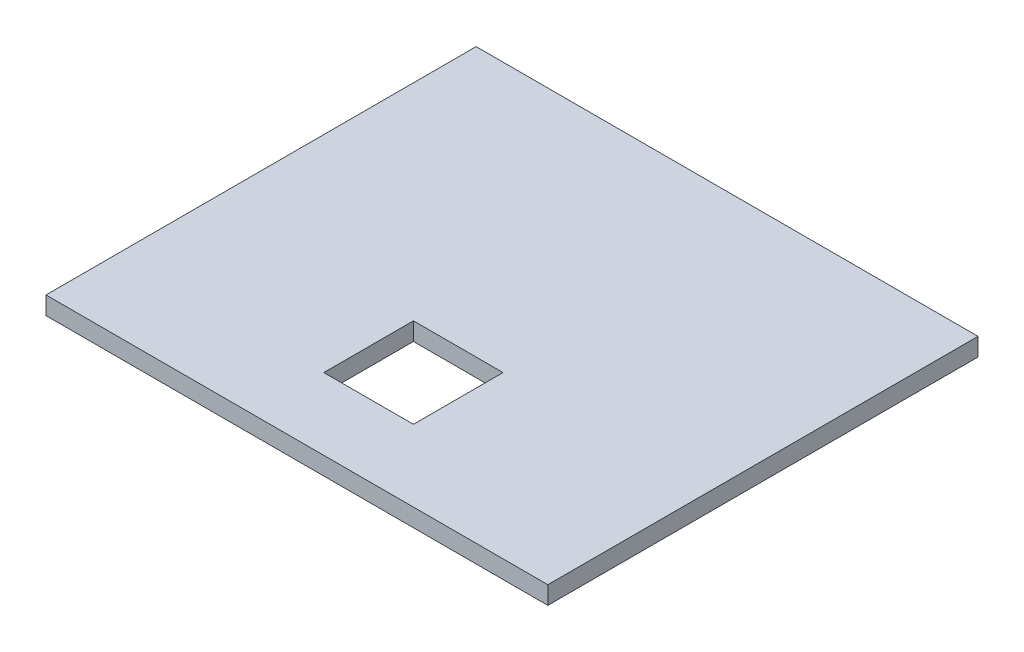
ISO-10303-21;
HEADER;
FILE_DESCRIPTION(('STEP AP214'),'2;1');
FILE_NAME('part.step','',(''),(''),'','','');
FILE_SCHEMA(('AUTOMOTIVE_DESIGN { 1 0 10303 214 1 1 1 1 }'));
ENDSEC;
DATA;
#1=APPLICATION_CONTEXT('core data for automotive mechanical design processes');
#2=APPLICATION_PROTOCOL_DEFINITION('international standard','automotive_design',2000,#1);
#3=PRODUCT_CONTEXT('',#1,'mechanical');
#4=PRODUCT('Part','Part','',(#3));
#5=PRODUCT_RELATED_PRODUCT_CATEGORY('part','',(#4));
#6=PRODUCT_DEFINITION_FORMATION('','',#4);
#7=PRODUCT_DEFINITION_CONTEXT('part definition',#1,'design');
#8=PRODUCT_DEFINITION('design','',#6,#7);
#9=PRODUCT_DEFINITION_SHAPE('','',#8);
#10=(LENGTH_UNIT() NAMED_UNIT(*) SI_UNIT(.MILLI.,.METRE.));
#11=(NAMED_UNIT(*) PLANE_ANGLE_UNIT() SI_UNIT($,.RADIAN.));
#12=(NAMED_UNIT(*) SI_UNIT($,.STERADIAN.) SOLID_ANGLE_UNIT());
#13=UNCERTAINTY_MEASURE_WITH_UNIT(LENGTH_MEASURE(1.E-05),#10,'distance_accuracy_value','');
#14=(GEOMETRIC_REPRESENTATION_CONTEXT(3) GLOBAL_UNCERTAINTY_ASSIGNED_CONTEXT((#13)) GLOBAL_UNIT_ASSIGNED_CONTEXT((#10,
#11,#12)) REPRESENTATION_CONTEXT('',''));
#15=CARTESIAN_POINT('',(0.,0.,0.));
#16=DIRECTION('',(0.,0.,1.));
#17=DIRECTION('',(1.,0.,0.));
#18=AXIS2_PLACEMENT_3D('',#15,#16,#17);
#19=CARTESIAN_POINT('',(88.9,6.35,76.2));
#20=DIRECTION('',(-1.,0.,0.));
#21=DIRECTION('',(0.,0.,1.));
#22=AXIS2_PLACEMENT_3D('',#19,#20,#21);
#23=PLANE('',#22);
#24=DIRECTION('',(0.,0.,-1.));
#25=VECTOR('',#24,1.);
#26=CARTESIAN_POINT('',(88.9,0.,76.2));
#27=LINE('',#26,#25);
#28=CARTESIAN_POINT('',(88.9,0.,76.2));
#29=VERTEX_POINT('',#28);
#30=CARTESIAN_POINT('',(88.9,0.,-76.2));
#31=VERTEX_POINT('',#30);
#32=EDGE_CURVE('E147',#29,#31,#27,.T.);
#33=ORIENTED_EDGE('',*,*,#32,.T.);
#34=DIRECTION('',(0.,-1.,0.));
#35=VECTOR('',#34,1.);
#36=CARTESIAN_POINT('',(88.9,6.35,-76.2));
#37=LINE('',#36,#35);
#38=CARTESIAN_POINT('',(88.9,6.35,-76.2));
#39=VERTEX_POINT('',#38);
#40=EDGE_CURVE('E11',#39,#31,#37,.T.);
#41=ORIENTED_EDGE('',*,*,#40,.F.);
#42=DIRECTION('',(0.,0.,-1.));
#43=VECTOR('',#42,1.);
#44=CARTESIAN_POINT('',(88.9,6.35,76.2));
#45=LINE('',#44,#43);
#46=CARTESIAN_POINT('',(88.9,6.35,76.2));
#47=VERTEX_POINT('',#46);
#48=EDGE_CURVE('E153',#47,#39,#45,.T.);
#49=ORIENTED_EDGE('',*,*,#48,.F.);
#50=DIRECTION('',(0.,-1.,0.));
#51=VECTOR('',#50,1.);
#52=CARTESIAN_POINT('',(88.9,6.35,76.2));
#53=LINE('',#52,#51);
#54=EDGE_CURVE('E167',#47,#29,#53,.T.);
#55=ORIENTED_EDGE('',*,*,#54,.T.);
#56=EDGE_LOOP('',(#33,#41,#49,#55));
#57=FACE_BOUND('',#56,.T.);
#58=ADVANCED_FACE('F39',(#57),#23,.F.);
#59=CARTESIAN_POINT('',(-88.9,6.35,-76.2));
#60=DIRECTION('',(0.,0.,1.));
#61=DIRECTION('',(1.,0.,0.));
#62=AXIS2_PLACEMENT_3D('',#59,#60,#61);
#63=PLANE('',#62);
#64=DIRECTION('',(-1.,0.,0.));
#65=VECTOR('',#64,1.);
#66=CARTESIAN_POINT('',(-88.9,0.,-76.2));
#67=LINE('',#66,#65);
#68=CARTESIAN_POINT('',(-88.9,0.,-76.2));
#69=VERTEX_POINT('',#68);
#70=EDGE_CURVE('E171',#31,#69,#67,.T.);
#71=ORIENTED_EDGE('',*,*,#70,.T.);
#72=DIRECTION('',(0.,-1.,0.));
#73=VECTOR('',#72,1.);
#74=CARTESIAN_POINT('',(-88.9,6.35,-76.2));
#75=LINE('',#74,#73);
#76=CARTESIAN_POINT('',(-88.9,6.35,-76.2));
#77=VERTEX_POINT('',#76);
#78=EDGE_CURVE('E47',#77,#69,#75,.T.);
#79=ORIENTED_EDGE('',*,*,#78,.F.);
#80=DIRECTION('',(-1.,0.,0.));
#81=VECTOR('',#80,1.);
#82=CARTESIAN_POINT('',(-88.9,6.35,-76.2));
#83=LINE('',#82,#81);
#84=EDGE_CURVE('E157',#39,#77,#83,.T.);
#85=ORIENTED_EDGE('',*,*,#84,.F.);
#86=ORIENTED_EDGE('',*,*,#40,.T.);
#87=EDGE_LOOP('',(#71,#79,#85,#86));
#88=FACE_BOUND('',#87,.T.);
#89=ADVANCED_FACE('F205',(#88),#63,.F.);
#90=CARTESIAN_POINT('',(-88.9,6.35,76.2));
#91=DIRECTION('',(1.,0.,0.));
#92=DIRECTION('',(0.,0.,-1.));
#93=AXIS2_PLACEMENT_3D('',#90,#91,#92);
#94=PLANE('',#93);
#95=DIRECTION('',(0.,0.,1.));
#96=VECTOR('',#95,1.);
#97=CARTESIAN_POINT('',(-88.9,0.,76.2));
#98=LINE('',#97,#96);
#99=CARTESIAN_POINT('',(-88.9,0.,76.2));
#100=VERTEX_POINT('',#99);
#101=EDGE_CURVE('E174',#69,#100,#98,.T.);
#102=ORIENTED_EDGE('',*,*,#101,.T.);
#103=DIRECTION('',(0.,-1.,0.));
#104=VECTOR('',#103,1.);
#105=CARTESIAN_POINT('',(-88.9,6.35,76.2));
#106=LINE('',#105,#104);
#107=CARTESIAN_POINT('',(-88.9,6.35,76.2));
#108=VERTEX_POINT('',#107);
#109=EDGE_CURVE('E182',#108,#100,#106,.T.);
#110=ORIENTED_EDGE('',*,*,#109,.F.);
#111=DIRECTION('',(0.,0.,1.));
#112=VECTOR('',#111,1.);
#113=CARTESIAN_POINT('',(-88.9,6.35,76.2));
#114=LINE('',#113,#112);
#115=EDGE_CURVE('E161',#77,#108,#114,.T.);
#116=ORIENTED_EDGE('',*,*,#115,.F.);
#117=ORIENTED_EDGE('',*,*,#78,.T.);
#118=EDGE_LOOP('',(#102,#110,#116,#117));
#119=FACE_BOUND('',#118,.T.);
#120=ADVANCED_FACE('F191',(#119),#94,.F.);
#121=CARTESIAN_POINT('',(-88.9,6.35,76.2));
#122=DIRECTION('',(0.,0.,-1.));
#123=DIRECTION('',(-1.,0.,0.));
#124=AXIS2_PLACEMENT_3D('',#121,#122,#123);
#125=PLANE('',#124);
#126=DIRECTION('',(1.,0.,0.));
#127=VECTOR('',#126,1.);
#128=CARTESIAN_POINT('',(-88.9,0.,76.2));
#129=LINE('',#128,#127);
#130=EDGE_CURVE('E158',#100,#29,#129,.T.);
#131=ORIENTED_EDGE('',*,*,#130,.T.);
#132=ORIENTED_EDGE('',*,*,#54,.F.);
#133=DIRECTION('',(1.,0.,0.));
#134=VECTOR('',#133,1.);
#135=CARTESIAN_POINT('',(-88.9,6.35,76.2));
#136=LINE('',#135,#134);
#137=EDGE_CURVE('E164',#108,#47,#136,.T.);
#138=ORIENTED_EDGE('',*,*,#137,.F.);
#139=ORIENTED_EDGE('',*,*,#109,.T.);
#140=EDGE_LOOP('',(#131,#132,#138,#139));
#141=FACE_BOUND('',#140,.T.);
#142=ADVANCED_FACE('F198',(#141),#125,.F.);
#143=CARTESIAN_POINT('',(0.,6.35,0.));
#144=DIRECTION('',(0.,-1.,0.));
#145=DIRECTION('',(0.,0.,-1.));
#146=AXIS2_PLACEMENT_3D('',#143,#144,#145);
#147=PLANE('',#146);
#148=DIRECTION('',(-1.,0.,0.));
#149=VECTOR('',#148,1.);
#150=CARTESIAN_POINT('',(-15.875,6.35,19.05));
#151=LINE('',#150,#149);
#152=CARTESIAN_POINT('',(15.875,6.35,19.05));
#153=VERTEX_POINT('',#152);
#154=CARTESIAN_POINT('',(-15.875,6.35,19.05));
#155=VERTEX_POINT('',#154);
#156=EDGE_CURVE('E138',#153,#155,#151,.T.);
#157=ORIENTED_EDGE('',*,*,#156,.F.);
#158=DIRECTION('',(0.,0.,-1.));
#159=VECTOR('',#158,1.);
#160=CARTESIAN_POINT('',(15.875,6.35,19.05));
#161=LINE('',#160,#159);
#162=CARTESIAN_POINT('',(15.875,6.35,50.8));
#163=VERTEX_POINT('',#162);
#164=EDGE_CURVE('E54',#163,#153,#161,.T.);
#165=ORIENTED_EDGE('',*,*,#164,.F.);
#166=DIRECTION('',(1.,0.,0.));
#167=VECTOR('',#166,1.);
#168=CARTESIAN_POINT('',(-15.875,6.35,50.8));
#169=LINE('',#168,#167);
#170=CARTESIAN_POINT('',(-15.875,6.35,50.8));
#171=VERTEX_POINT('',#170);
#172=EDGE_CURVE('E125',#171,#163,#169,.T.);
#173=ORIENTED_EDGE('',*,*,#172,.F.);
#174=DIRECTION('',(0.,0.,1.));
#175=VECTOR('',#174,1.);
#176=CARTESIAN_POINT('',(-15.875,6.35,19.05));
#177=LINE('',#176,#175);
#178=EDGE_CURVE('E129',#155,#171,#177,.T.);
#179=ORIENTED_EDGE('',*,*,#178,.F.);
#180=EDGE_LOOP('',(#157,#165,#173,#179));
#181=FACE_BOUND('',#180,.T.);
#182=ORIENTED_EDGE('',*,*,#48,.T.);
#183=ORIENTED_EDGE('',*,*,#84,.T.);
#184=ORIENTED_EDGE('',*,*,#115,.T.);
#185=ORIENTED_EDGE('',*,*,#137,.T.);
#186=EDGE_LOOP('',(#182,#183,#184,#185));
#187=FACE_BOUND('',#186,.T.);
#188=ADVANCED_FACE('F204',(#181,#187),#147,.F.);
#189=CARTESIAN_POINT('',(0.,0.,0.));
#190=DIRECTION('',(0.,-1.,0.));
#191=DIRECTION('',(0.,0.,-1.));
#192=AXIS2_PLACEMENT_3D('',#189,#190,#191);
#193=PLANE('',#192);
#194=DIRECTION('',(0.,0.,-1.));
#195=VECTOR('',#194,1.);
#196=CARTESIAN_POINT('',(15.875,0.,19.05));
#197=LINE('',#196,#195);
#198=CARTESIAN_POINT('',(15.875,0.,50.8));
#199=VERTEX_POINT('',#198);
#200=CARTESIAN_POINT('',(15.875,0.,19.05));
#201=VERTEX_POINT('',#200);
#202=EDGE_CURVE('E106',#199,#201,#197,.T.);
#203=ORIENTED_EDGE('',*,*,#202,.T.);
#204=DIRECTION('',(-1.,0.,0.));
#205=VECTOR('',#204,1.);
#206=CARTESIAN_POINT('',(-15.875,0.,19.05));
#207=LINE('',#206,#205);
#208=CARTESIAN_POINT('',(-15.875,0.,19.05));
#209=VERTEX_POINT('',#208);
#210=EDGE_CURVE('E116',#201,#209,#207,.T.);
#211=ORIENTED_EDGE('',*,*,#210,.T.);
#212=DIRECTION('',(0.,0.,1.));
#213=VECTOR('',#212,1.);
#214=CARTESIAN_POINT('',(-15.875,0.,19.05));
#215=LINE('',#214,#213);
#216=CARTESIAN_POINT('',(-15.875,0.,50.8));
#217=VERTEX_POINT('',#216);
#218=EDGE_CURVE('E62',#209,#217,#215,.T.);
#219=ORIENTED_EDGE('',*,*,#218,.T.);
#220=DIRECTION('',(1.,0.,0.));
#221=VECTOR('',#220,1.);
#222=CARTESIAN_POINT('',(-15.875,0.,50.8));
#223=LINE('',#222,#221);
#224=EDGE_CURVE('E113',#217,#199,#223,.T.);
#225=ORIENTED_EDGE('',*,*,#224,.T.);
#226=EDGE_LOOP('',(#203,#211,#219,#225));
#227=FACE_BOUND('',#226,.T.);
#228=ORIENTED_EDGE('',*,*,#32,.F.);
#229=ORIENTED_EDGE('',*,*,#130,.F.);
#230=ORIENTED_EDGE('',*,*,#101,.F.);
#231=ORIENTED_EDGE('',*,*,#70,.F.);
#232=EDGE_LOOP('',(#228,#229,#230,#231));
#233=FACE_BOUND('',#232,.T.);
#234=ADVANCED_FACE('F121',(#227,#233),#193,.T.);
#235=CARTESIAN_POINT('',(15.875,0.,19.05));
#236=DIRECTION('',(1.,0.,0.));
#237=DIRECTION('',(0.,0.,-1.));
#238=AXIS2_PLACEMENT_3D('',#235,#236,#237);
#239=PLANE('',#238);
#240=ORIENTED_EDGE('',*,*,#164,.T.);
#241=DIRECTION('',(0.,1.,0.));
#242=VECTOR('',#241,1.);
#243=CARTESIAN_POINT('',(15.875,0.,19.05));
#244=LINE('',#243,#242);
#245=EDGE_CURVE('E102',#201,#153,#244,.T.);
#246=ORIENTED_EDGE('',*,*,#245,.F.);
#247=ORIENTED_EDGE('',*,*,#202,.F.);
#248=DIRECTION('',(0.,1.,0.));
#249=VECTOR('',#248,1.);
#250=CARTESIAN_POINT('',(15.875,0.,50.8));
#251=LINE('',#250,#249);
#252=EDGE_CURVE('E144',#199,#163,#251,.T.);
#253=ORIENTED_EDGE('',*,*,#252,.T.);
#254=EDGE_LOOP('',(#240,#246,#247,#253));
#255=FACE_BOUND('',#254,.T.);
#256=ADVANCED_FACE('F104',(#255),#239,.F.);
#257=CARTESIAN_POINT('',(-15.875,0.,50.8));
#258=DIRECTION('',(0.,0.,1.));
#259=DIRECTION('',(1.,0.,0.));
#260=AXIS2_PLACEMENT_3D('',#257,#258,#259);
#261=PLANE('',#260);
#262=ORIENTED_EDGE('',*,*,#172,.T.);
#263=ORIENTED_EDGE('',*,*,#252,.F.);
#264=ORIENTED_EDGE('',*,*,#224,.F.);
#265=DIRECTION('',(0.,1.,0.));
#266=VECTOR('',#265,1.);
#267=CARTESIAN_POINT('',(-15.875,0.,50.8));
#268=LINE('',#267,#266);
#269=EDGE_CURVE('E148',#217,#171,#268,.T.);
#270=ORIENTED_EDGE('',*,*,#269,.T.);
#271=EDGE_LOOP('',(#262,#263,#264,#270));
#272=FACE_BOUND('',#271,.T.);
#273=ADVANCED_FACE('F222',(#272),#261,.F.);
#274=CARTESIAN_POINT('',(-15.875,0.,19.05));
#275=DIRECTION('',(-1.,0.,0.));
#276=DIRECTION('',(0.,0.,1.));
#277=AXIS2_PLACEMENT_3D('',#274,#275,#276);
#278=PLANE('',#277);
#279=ORIENTED_EDGE('',*,*,#178,.T.);
#280=ORIENTED_EDGE('',*,*,#269,.F.);
#281=ORIENTED_EDGE('',*,*,#218,.F.);
#282=DIRECTION('',(0.,1.,0.));
#283=VECTOR('',#282,1.);
#284=CARTESIAN_POINT('',(-15.875,0.,19.05));
#285=LINE('',#284,#283);
#286=EDGE_CURVE('E112',#209,#155,#285,.T.);
#287=ORIENTED_EDGE('',*,*,#286,.T.);
#288=EDGE_LOOP('',(#279,#280,#281,#287));
#289=FACE_BOUND('',#288,.T.);
#290=ADVANCED_FACE('F225',(#289),#278,.F.);
#291=CARTESIAN_POINT('',(-15.875,0.,19.05));
#292=DIRECTION('',(0.,0.,-1.));
#293=DIRECTION('',(-1.,0.,0.));
#294=AXIS2_PLACEMENT_3D('',#291,#292,#293);
#295=PLANE('',#294);
#296=ORIENTED_EDGE('',*,*,#156,.T.);
#297=ORIENTED_EDGE('',*,*,#286,.F.);
#298=ORIENTED_EDGE('',*,*,#210,.F.);
#299=ORIENTED_EDGE('',*,*,#245,.T.);
#300=EDGE_LOOP('',(#296,#297,#298,#299));
#301=FACE_BOUND('',#300,.T.);
#302=ADVANCED_FACE('F117',(#301),#295,.F.);
#303=CLOSED_SHELL('',(#58,#89,#120,#142,#188,#234,#256,#273,#290,#302));
#304=MANIFOLD_SOLID_BREP('B2',#303);
#305=ADVANCED_BREP_SHAPE_REPRESENTATION('',(#18,#304),#14);
#306=SHAPE_DEFINITION_REPRESENTATION(#9,#305);
ENDSEC;
END-ISO-10303-21;
